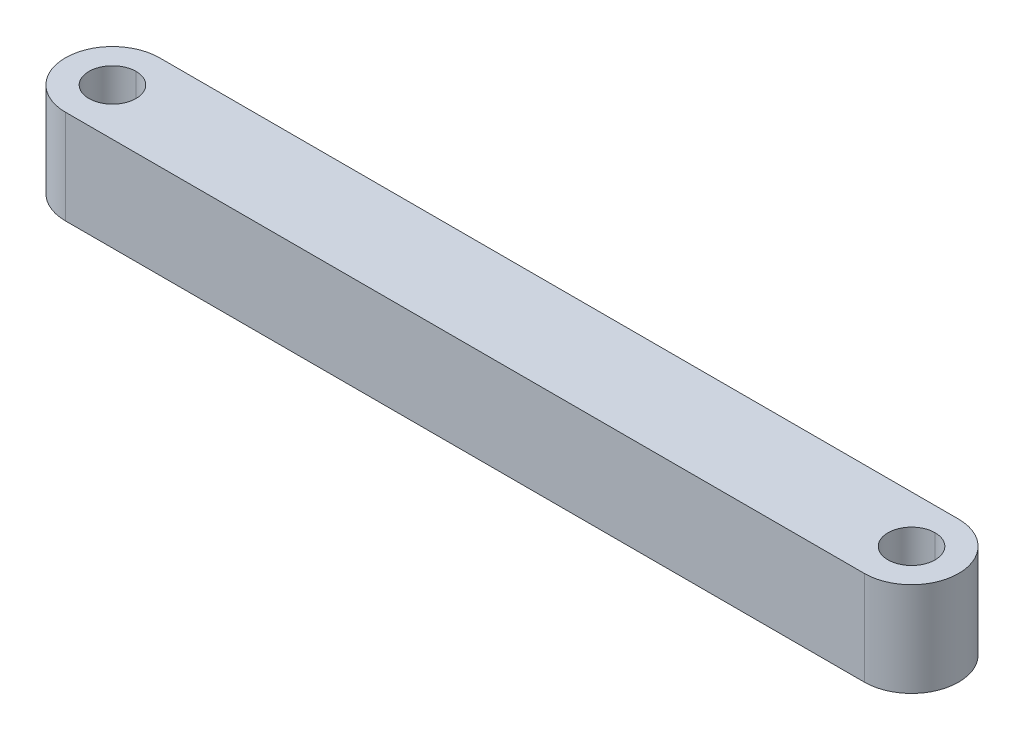
ISO-10303-21;
HEADER;
FILE_DESCRIPTION(('STEP AP214'),'2;1');
FILE_NAME('part.step','',(''),(''),'','','');
FILE_SCHEMA(('AUTOMOTIVE_DESIGN { 1 0 10303 214 1 1 1 1 }'));
ENDSEC;
DATA;
#1=APPLICATION_CONTEXT('core data for automotive mechanical design processes');
#2=APPLICATION_PROTOCOL_DEFINITION('international standard','automotive_design',2000,#1);
#3=PRODUCT_CONTEXT('',#1,'mechanical');
#4=PRODUCT('Part','Part','',(#3));
#5=PRODUCT_RELATED_PRODUCT_CATEGORY('part','',(#4));
#6=PRODUCT_DEFINITION_FORMATION('','',#4);
#7=PRODUCT_DEFINITION_CONTEXT('part definition',#1,'design');
#8=PRODUCT_DEFINITION('design','',#6,#7);
#9=PRODUCT_DEFINITION_SHAPE('','',#8);
#10=(LENGTH_UNIT() NAMED_UNIT(*) SI_UNIT(.MILLI.,.METRE.));
#11=(NAMED_UNIT(*) PLANE_ANGLE_UNIT() SI_UNIT($,.RADIAN.));
#12=(NAMED_UNIT(*) SI_UNIT($,.STERADIAN.) SOLID_ANGLE_UNIT());
#13=UNCERTAINTY_MEASURE_WITH_UNIT(LENGTH_MEASURE(1.E-05),#10,'distance_accuracy_value','');
#14=(GEOMETRIC_REPRESENTATION_CONTEXT(3) GLOBAL_UNCERTAINTY_ASSIGNED_CONTEXT((#13)) GLOBAL_UNIT_ASSIGNED_CONTEXT((#10,
#11,#12)) REPRESENTATION_CONTEXT('',''));
#15=CARTESIAN_POINT('',(0.,0.,0.));
#16=DIRECTION('',(0.,0.,1.));
#17=DIRECTION('',(1.,0.,0.));
#18=AXIS2_PLACEMENT_3D('',#15,#16,#17);
#19=CARTESIAN_POINT('',(0.,10.,0.));
#20=DIRECTION('',(0.,-1.,0.));
#21=DIRECTION('',(0.,0.,-1.));
#22=AXIS2_PLACEMENT_3D('',#19,#20,#21);
#23=CYLINDRICAL_SURFACE('',#22,2.5);
#24=DIRECTION('',(0.,-1.,0.));
#25=VECTOR('',#24,1.);
#26=CARTESIAN_POINT('',(0.,10.,2.5));
#27=LINE('',#26,#25);
#28=CARTESIAN_POINT('',(0.,10.,2.5));
#29=VERTEX_POINT('',#28);
#30=CARTESIAN_POINT('',(0.,0.,2.5));
#31=VERTEX_POINT('',#30);
#32=EDGE_CURVE('E153',#29,#31,#27,.T.);
#33=ORIENTED_EDGE('',*,*,#32,.F.);
#34=CARTESIAN_POINT('',(0.,10.,0.));
#35=DIRECTION('',(0.,1.,0.));
#36=DIRECTION('',(0.,0.,1.));
#37=AXIS2_PLACEMENT_3D('',#34,#35,#36);
#38=CIRCLE('',#37,2.5);
#39=CARTESIAN_POINT('',(0.,10.,-2.5));
#40=VERTEX_POINT('',#39);
#41=EDGE_CURVE('E114',#29,#40,#38,.T.);
#42=ORIENTED_EDGE('',*,*,#41,.T.);
#43=DIRECTION('',(0.,-1.,0.));
#44=VECTOR('',#43,1.);
#45=CARTESIAN_POINT('',(0.,10.,-2.5));
#46=LINE('',#45,#44);
#47=CARTESIAN_POINT('',(0.,0.,-2.5));
#48=VERTEX_POINT('',#47);
#49=EDGE_CURVE('E129',#40,#48,#46,.T.);
#50=ORIENTED_EDGE('',*,*,#49,.T.);
#51=CARTESIAN_POINT('',(0.,0.,0.));
#52=DIRECTION('',(0.,1.,0.));
#53=DIRECTION('',(0.,0.,1.));
#54=AXIS2_PLACEMENT_3D('',#51,#52,#53);
#55=CIRCLE('',#54,2.5);
#56=EDGE_CURVE('E146',#31,#48,#55,.T.);
#57=ORIENTED_EDGE('',*,*,#56,.F.);
#58=EDGE_LOOP('',(#33,#42,#50,#57));
#59=FACE_BOUND('',#58,.T.);
#60=ADVANCED_FACE('F15',(#59),#23,.F.);
#61=CARTESIAN_POINT('',(84.85281374,10.,0.));
#62=DIRECTION('',(0.,-1.,0.));
#63=DIRECTION('',(0.,0.,-1.));
#64=AXIS2_PLACEMENT_3D('',#61,#62,#63);
#65=CYLINDRICAL_SURFACE('',#64,2.5);
#66=DIRECTION('',(0.,-1.,0.));
#67=VECTOR('',#66,1.);
#68=CARTESIAN_POINT('',(84.85281374,10.,2.5));
#69=LINE('',#68,#67);
#70=CARTESIAN_POINT('',(84.85281374,10.,2.5));
#71=VERTEX_POINT('',#70);
#72=CARTESIAN_POINT('',(84.85281374,0.,2.5));
#73=VERTEX_POINT('',#72);
#74=EDGE_CURVE('E118',#71,#73,#69,.T.);
#75=ORIENTED_EDGE('',*,*,#74,.F.);
#76=CARTESIAN_POINT('',(84.85281374,10.,0.));
#77=DIRECTION('',(0.,1.,0.));
#78=DIRECTION('',(0.,0.,1.));
#79=AXIS2_PLACEMENT_3D('',#76,#77,#78);
#80=CIRCLE('',#79,2.5);
#81=CARTESIAN_POINT('',(84.85281374,10.,-2.5));
#82=VERTEX_POINT('',#81);
#83=EDGE_CURVE('E104',#71,#82,#80,.T.);
#84=ORIENTED_EDGE('',*,*,#83,.T.);
#85=DIRECTION('',(0.,-1.,0.));
#86=VECTOR('',#85,1.);
#87=CARTESIAN_POINT('',(84.85281374,10.,-2.5));
#88=LINE('',#87,#86);
#89=CARTESIAN_POINT('',(84.85281374,0.,-2.5));
#90=VERTEX_POINT('',#89);
#91=EDGE_CURVE('E127',#82,#90,#88,.T.);
#92=ORIENTED_EDGE('',*,*,#91,.T.);
#93=CARTESIAN_POINT('',(84.85281374,0.,0.));
#94=DIRECTION('',(0.,1.,0.));
#95=DIRECTION('',(0.,0.,1.));
#96=AXIS2_PLACEMENT_3D('',#93,#94,#95);
#97=CIRCLE('',#96,2.5);
#98=EDGE_CURVE('E19',#73,#90,#97,.T.);
#99=ORIENTED_EDGE('',*,*,#98,.F.);
#100=EDGE_LOOP('',(#75,#84,#92,#99));
#101=FACE_BOUND('',#100,.T.);
#102=ADVANCED_FACE('F119',(#101),#65,.F.);
#103=CARTESIAN_POINT('',(0.,10.,-5.));
#104=DIRECTION('',(0.,0.,1.));
#105=DIRECTION('',(1.,0.,0.));
#106=AXIS2_PLACEMENT_3D('',#103,#104,#105);
#107=PLANE('',#106);
#108=DIRECTION('',(-1.,0.,0.));
#109=VECTOR('',#108,1.);
#110=CARTESIAN_POINT('',(0.,0.,-5.));
#111=LINE('',#110,#109);
#112=CARTESIAN_POINT('',(84.85281374,0.,-5.));
#113=VERTEX_POINT('',#112);
#114=CARTESIAN_POINT('',(0.,0.,-5.));
#115=VERTEX_POINT('',#114);
#116=EDGE_CURVE('E154',#113,#115,#111,.T.);
#117=ORIENTED_EDGE('',*,*,#116,.T.);
#118=DIRECTION('',(0.,-1.,0.));
#119=VECTOR('',#118,1.);
#120=CARTESIAN_POINT('',(0.,10.,-5.));
#121=LINE('',#120,#119);
#122=CARTESIAN_POINT('',(0.,10.,-5.));
#123=VERTEX_POINT('',#122);
#124=EDGE_CURVE('E172',#123,#115,#121,.T.);
#125=ORIENTED_EDGE('',*,*,#124,.F.);
#126=DIRECTION('',(-1.,0.,0.));
#127=VECTOR('',#126,1.);
#128=CARTESIAN_POINT('',(0.,10.,-5.));
#129=LINE('',#128,#127);
#130=CARTESIAN_POINT('',(84.85281374,10.,-5.));
#131=VERTEX_POINT('',#130);
#132=EDGE_CURVE('E115',#131,#123,#129,.T.);
#133=ORIENTED_EDGE('',*,*,#132,.F.);
#134=DIRECTION('',(0.,-1.,0.));
#135=VECTOR('',#134,1.);
#136=CARTESIAN_POINT('',(84.85281374,10.,-5.));
#137=LINE('',#136,#135);
#138=EDGE_CURVE('E9',#131,#113,#137,.T.);
#139=ORIENTED_EDGE('',*,*,#138,.T.);
#140=EDGE_LOOP('',(#117,#125,#133,#139));
#141=FACE_BOUND('',#140,.T.);
#142=ADVANCED_FACE('F309',(#141),#107,.F.);
#143=CARTESIAN_POINT('',(84.85281374,10.,0.));
#144=DIRECTION('',(0.,-1.,0.));
#145=DIRECTION('',(0.,0.,-1.));
#146=AXIS2_PLACEMENT_3D('',#143,#144,#145);
#147=CYLINDRICAL_SURFACE('',#146,5.);
#148=CARTESIAN_POINT('',(84.85281374,0.,0.));
#149=DIRECTION('',(0.,1.,0.));
#150=DIRECTION('',(0.,0.,1.));
#151=AXIS2_PLACEMENT_3D('',#148,#149,#150);
#152=CIRCLE('',#151,5.);
#153=CARTESIAN_POINT('',(84.85281374,0.,5.));
#154=VERTEX_POINT('',#153);
#155=EDGE_CURVE('E158',#154,#113,#152,.T.);
#156=ORIENTED_EDGE('',*,*,#155,.T.);
#157=ORIENTED_EDGE('',*,*,#138,.F.);
#158=CARTESIAN_POINT('',(84.85281374,10.,0.));
#159=DIRECTION('',(0.,1.,0.));
#160=DIRECTION('',(0.,0.,1.));
#161=AXIS2_PLACEMENT_3D('',#158,#159,#160);
#162=CIRCLE('',#161,5.);
#163=CARTESIAN_POINT('',(84.85281374,10.,5.));
#164=VERTEX_POINT('',#163);
#165=EDGE_CURVE('E144',#164,#131,#162,.T.);
#166=ORIENTED_EDGE('',*,*,#165,.F.);
#167=DIRECTION('',(0.,-1.,0.));
#168=VECTOR('',#167,1.);
#169=CARTESIAN_POINT('',(84.85281374,10.,5.));
#170=LINE('',#169,#168);
#171=EDGE_CURVE('E26',#164,#154,#170,.T.);
#172=ORIENTED_EDGE('',*,*,#171,.T.);
#173=EDGE_LOOP('',(#156,#157,#166,#172));
#174=FACE_BOUND('',#173,.T.);
#175=ADVANCED_FACE('F305',(#174),#147,.T.);
#176=CARTESIAN_POINT('',(0.,10.,5.));
#177=DIRECTION('',(0.,0.,-1.));
#178=DIRECTION('',(-1.,0.,0.));
#179=AXIS2_PLACEMENT_3D('',#176,#177,#178);
#180=PLANE('',#179);
#181=DIRECTION('',(1.,0.,0.));
#182=VECTOR('',#181,1.);
#183=CARTESIAN_POINT('',(0.,0.,5.));
#184=LINE('',#183,#182);
#185=CARTESIAN_POINT('',(0.,0.,5.));
#186=VERTEX_POINT('',#185);
#187=EDGE_CURVE('E160',#186,#154,#184,.T.);
#188=ORIENTED_EDGE('',*,*,#187,.T.);
#189=ORIENTED_EDGE('',*,*,#171,.F.);
#190=DIRECTION('',(1.,0.,0.));
#191=VECTOR('',#190,1.);
#192=CARTESIAN_POINT('',(0.,10.,5.));
#193=LINE('',#192,#191);
#194=CARTESIAN_POINT('',(0.,10.,5.));
#195=VERTEX_POINT('',#194);
#196=EDGE_CURVE('E140',#195,#164,#193,.T.);
#197=ORIENTED_EDGE('',*,*,#196,.F.);
#198=DIRECTION('',(0.,-1.,0.));
#199=VECTOR('',#198,1.);
#200=CARTESIAN_POINT('',(0.,10.,5.));
#201=LINE('',#200,#199);
#202=EDGE_CURVE('E149',#195,#186,#201,.T.);
#203=ORIENTED_EDGE('',*,*,#202,.T.);
#204=EDGE_LOOP('',(#188,#189,#197,#203));
#205=FACE_BOUND('',#204,.T.);
#206=ADVANCED_FACE('F197',(#205),#180,.F.);
#207=CARTESIAN_POINT('',(0.,10.,0.));
#208=DIRECTION('',(0.,-1.,0.));
#209=DIRECTION('',(0.,0.,-1.));
#210=AXIS2_PLACEMENT_3D('',#207,#208,#209);
#211=CYLINDRICAL_SURFACE('',#210,5.);
#212=CARTESIAN_POINT('',(0.,0.,0.));
#213=DIRECTION('',(0.,1.,0.));
#214=DIRECTION('',(0.,0.,1.));
#215=AXIS2_PLACEMENT_3D('',#212,#213,#214);
#216=CIRCLE('',#215,5.);
#217=EDGE_CURVE('E159',#115,#186,#216,.T.);
#218=ORIENTED_EDGE('',*,*,#217,.T.);
#219=ORIENTED_EDGE('',*,*,#202,.F.);
#220=CARTESIAN_POINT('',(0.,10.,0.));
#221=DIRECTION('',(0.,1.,0.));
#222=DIRECTION('',(0.,0.,1.));
#223=AXIS2_PLACEMENT_3D('',#220,#221,#222);
#224=CIRCLE('',#223,5.);
#225=EDGE_CURVE('E145',#123,#195,#224,.T.);
#226=ORIENTED_EDGE('',*,*,#225,.F.);
#227=ORIENTED_EDGE('',*,*,#124,.T.);
#228=EDGE_LOOP('',(#218,#219,#226,#227));
#229=FACE_BOUND('',#228,.T.);
#230=ADVANCED_FACE('F205',(#229),#211,.T.);
#231=CARTESIAN_POINT('',(0.,0.,0.));
#232=DIRECTION('',(0.,1.,0.));
#233=DIRECTION('',(1.,0.,0.));
#234=AXIS2_PLACEMENT_3D('',#231,#232,#233);
#235=PLANE('',#234);
#236=CARTESIAN_POINT('',(0.,0.,0.));
#237=DIRECTION('',(0.,1.,0.));
#238=DIRECTION('',(0.,0.,1.));
#239=AXIS2_PLACEMENT_3D('',#236,#237,#238);
#240=CIRCLE('',#239,2.5);
#241=EDGE_CURVE('E136',#48,#31,#240,.T.);
#242=ORIENTED_EDGE('',*,*,#241,.T.);
#243=ORIENTED_EDGE('',*,*,#56,.T.);
#244=EDGE_LOOP('',(#242,#243));
#245=FACE_BOUND('',#244,.T.);
#246=CARTESIAN_POINT('',(84.85281374,0.,0.));
#247=DIRECTION('',(0.,1.,0.));
#248=DIRECTION('',(0.,0.,1.));
#249=AXIS2_PLACEMENT_3D('',#246,#247,#248);
#250=CIRCLE('',#249,2.5);
#251=EDGE_CURVE('E124',#90,#73,#250,.T.);
#252=ORIENTED_EDGE('',*,*,#251,.T.);
#253=ORIENTED_EDGE('',*,*,#98,.T.);
#254=EDGE_LOOP('',(#252,#253));
#255=FACE_BOUND('',#254,.T.);
#256=ORIENTED_EDGE('',*,*,#217,.F.);
#257=ORIENTED_EDGE('',*,*,#116,.F.);
#258=ORIENTED_EDGE('',*,*,#155,.F.);
#259=ORIENTED_EDGE('',*,*,#187,.F.);
#260=EDGE_LOOP('',(#256,#257,#258,#259));
#261=FACE_BOUND('',#260,.T.);
#262=ADVANCED_FACE('F203',(#245,#255,#261),#235,.F.);
#263=CARTESIAN_POINT('',(0.,10.,0.));
#264=DIRECTION('',(0.,1.,0.));
#265=DIRECTION('',(1.,0.,0.));
#266=AXIS2_PLACEMENT_3D('',#263,#264,#265);
#267=PLANE('',#266);
#268=CARTESIAN_POINT('',(0.,10.,0.));
#269=DIRECTION('',(0.,1.,0.));
#270=DIRECTION('',(0.,0.,1.));
#271=AXIS2_PLACEMENT_3D('',#268,#269,#270);
#272=CIRCLE('',#271,2.5);
#273=EDGE_CURVE('E163',#40,#29,#272,.T.);
#274=ORIENTED_EDGE('',*,*,#273,.F.);
#275=ORIENTED_EDGE('',*,*,#41,.F.);
#276=EDGE_LOOP('',(#274,#275));
#277=FACE_BOUND('',#276,.T.);
#278=CARTESIAN_POINT('',(84.85281374,10.,0.));
#279=DIRECTION('',(0.,1.,0.));
#280=DIRECTION('',(0.,0.,1.));
#281=AXIS2_PLACEMENT_3D('',#278,#279,#280);
#282=CIRCLE('',#281,2.5);
#283=EDGE_CURVE('E109',#82,#71,#282,.T.);
#284=ORIENTED_EDGE('',*,*,#283,.F.);
#285=ORIENTED_EDGE('',*,*,#83,.F.);
#286=EDGE_LOOP('',(#284,#285));
#287=FACE_BOUND('',#286,.T.);
#288=ORIENTED_EDGE('',*,*,#225,.T.);
#289=ORIENTED_EDGE('',*,*,#196,.T.);
#290=ORIENTED_EDGE('',*,*,#165,.T.);
#291=ORIENTED_EDGE('',*,*,#132,.T.);
#292=EDGE_LOOP('',(#288,#289,#290,#291));
#293=FACE_BOUND('',#292,.T.);
#294=ADVANCED_FACE('F106',(#277,#287,#293),#267,.T.);
#295=CARTESIAN_POINT('',(84.85281374,10.,0.));
#296=DIRECTION('',(0.,-1.,0.));
#297=DIRECTION('',(0.,0.,-1.));
#298=AXIS2_PLACEMENT_3D('',#295,#296,#297);
#299=CYLINDRICAL_SURFACE('',#298,2.5);
#300=ORIENTED_EDGE('',*,*,#283,.T.);
#301=ORIENTED_EDGE('',*,*,#74,.T.);
#302=ORIENTED_EDGE('',*,*,#251,.F.);
#303=ORIENTED_EDGE('',*,*,#91,.F.);
#304=EDGE_LOOP('',(#300,#301,#302,#303));
#305=FACE_BOUND('',#304,.T.);
#306=ADVANCED_FACE('F126',(#305),#299,.F.);
#307=CARTESIAN_POINT('',(0.,10.,0.));
#308=DIRECTION('',(0.,-1.,0.));
#309=DIRECTION('',(0.,0.,-1.));
#310=AXIS2_PLACEMENT_3D('',#307,#308,#309);
#311=CYLINDRICAL_SURFACE('',#310,2.5);
#312=ORIENTED_EDGE('',*,*,#273,.T.);
#313=ORIENTED_EDGE('',*,*,#32,.T.);
#314=ORIENTED_EDGE('',*,*,#241,.F.);
#315=ORIENTED_EDGE('',*,*,#49,.F.);
#316=EDGE_LOOP('',(#312,#313,#314,#315));
#317=FACE_BOUND('',#316,.T.);
#318=ADVANCED_FACE('F17',(#317),#311,.F.);
#319=CLOSED_SHELL('',(#60,#102,#142,#175,#206,#230,#262,#294,#306,#318));
#320=MANIFOLD_SOLID_BREP('B1',#319);
#321=ADVANCED_BREP_SHAPE_REPRESENTATION('',(#18,#320),#14);
#322=SHAPE_DEFINITION_REPRESENTATION(#9,#321);
ENDSEC;
END-ISO-10303-21;
